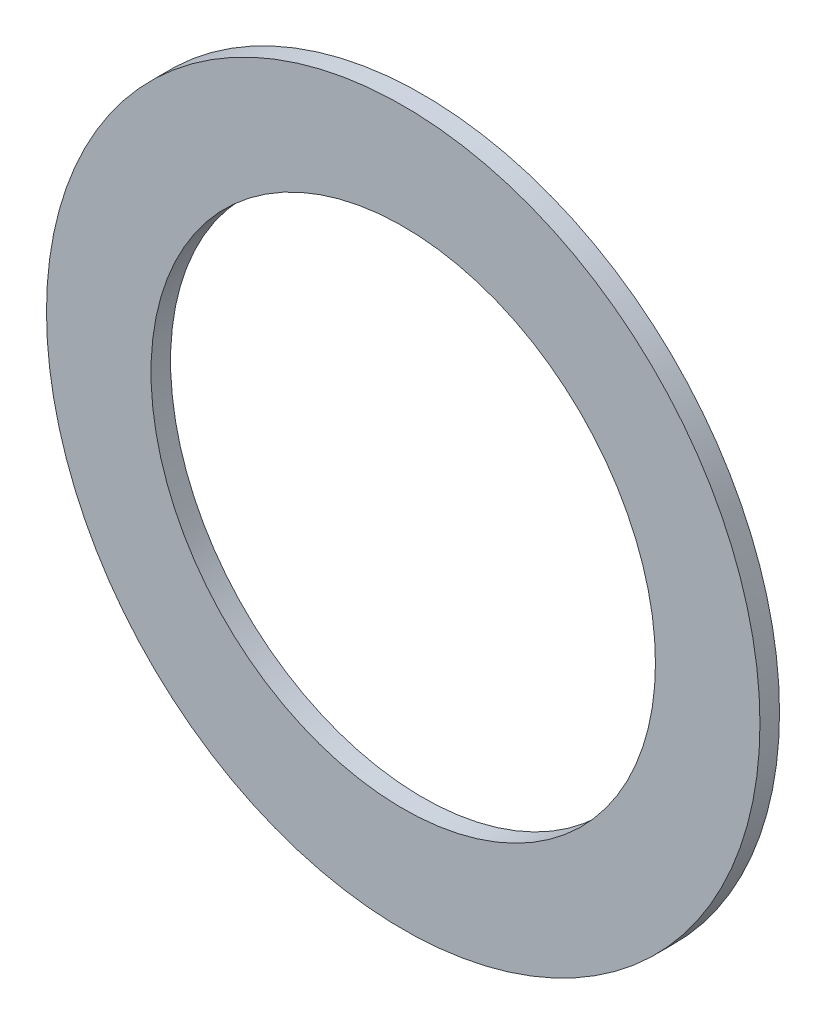
ISO-10303-21;
HEADER;
FILE_DESCRIPTION(('STEP AP214'),'2;1');
FILE_NAME('part.step','',(''),(''),'','','');
FILE_SCHEMA(('AUTOMOTIVE_DESIGN { 1 0 10303 214 1 1 1 1 }'));
ENDSEC;
DATA;
#1=APPLICATION_CONTEXT('core data for automotive mechanical design processes');
#2=APPLICATION_PROTOCOL_DEFINITION('international standard','automotive_design',2000,#1);
#3=PRODUCT_CONTEXT('',#1,'mechanical');
#4=PRODUCT('Part','Part','',(#3));
#5=PRODUCT_RELATED_PRODUCT_CATEGORY('part','',(#4));
#6=PRODUCT_DEFINITION_FORMATION('','',#4);
#7=PRODUCT_DEFINITION_CONTEXT('part definition',#1,'design');
#8=PRODUCT_DEFINITION('design','',#6,#7);
#9=PRODUCT_DEFINITION_SHAPE('','',#8);
#10=(LENGTH_UNIT() NAMED_UNIT(*) SI_UNIT(.MILLI.,.METRE.));
#11=(NAMED_UNIT(*) PLANE_ANGLE_UNIT() SI_UNIT($,.RADIAN.));
#12=(NAMED_UNIT(*) SI_UNIT($,.STERADIAN.) SOLID_ANGLE_UNIT());
#13=UNCERTAINTY_MEASURE_WITH_UNIT(LENGTH_MEASURE(1.E-05),#10,'distance_accuracy_value','');
#14=(GEOMETRIC_REPRESENTATION_CONTEXT(3) GLOBAL_UNCERTAINTY_ASSIGNED_CONTEXT((#13)) GLOBAL_UNIT_ASSIGNED_CONTEXT((#10,
#11,#12)) REPRESENTATION_CONTEXT('',''));
#15=CARTESIAN_POINT('',(0.,0.,0.));
#16=DIRECTION('',(0.,0.,1.));
#17=DIRECTION('',(1.,0.,0.));
#18=AXIS2_PLACEMENT_3D('',#15,#16,#17);
#19=CARTESIAN_POINT('',(0.,0.,4.));
#20=DIRECTION('',(0.,0.,-1.));
#21=DIRECTION('',(-1.,0.,0.));
#22=AXIS2_PLACEMENT_3D('',#19,#20,#21);
#23=CYLINDRICAL_SURFACE('',#22,51.6125);
#24=CARTESIAN_POINT('',(0.,0.,4.));
#25=DIRECTION('',(0.,0.,1.));
#26=DIRECTION('',(1.,0.,0.));
#27=AXIS2_PLACEMENT_3D('',#24,#25,#26);
#28=CIRCLE('',#27,51.6125);
#29=CARTESIAN_POINT('',(51.6125,0.,4.));
#30=VERTEX_POINT('',#29);
#31=EDGE_CURVE('E40',#30,#30,#28,.T.);
#32=ORIENTED_EDGE('',*,*,#31,.T.);
#33=EDGE_LOOP('',(#32));
#34=FACE_BOUND('',#33,.T.);
#35=CARTESIAN_POINT('',(0.,0.,0.));
#36=DIRECTION('',(0.,0.,1.));
#37=DIRECTION('',(1.,0.,0.));
#38=AXIS2_PLACEMENT_3D('',#35,#36,#37);
#39=CIRCLE('',#38,51.6125);
#40=CARTESIAN_POINT('',(51.6125,0.,0.));
#41=VERTEX_POINT('',#40);
#42=EDGE_CURVE('E46',#41,#41,#39,.T.);
#43=ORIENTED_EDGE('',*,*,#42,.F.);
#44=EDGE_LOOP('',(#43));
#45=FACE_BOUND('',#44,.T.);
#46=ADVANCED_FACE('F33',(#34,#45),#23,.F.);
#47=CARTESIAN_POINT('',(0.,0.,4.));
#48=DIRECTION('',(0.,0.,-1.));
#49=DIRECTION('',(-1.,0.,0.));
#50=AXIS2_PLACEMENT_3D('',#47,#48,#49);
#51=CYLINDRICAL_SURFACE('',#50,73.);
#52=CARTESIAN_POINT('',(0.,0.,4.));
#53=DIRECTION('',(0.,0.,1.));
#54=DIRECTION('',(1.,0.,0.));
#55=AXIS2_PLACEMENT_3D('',#52,#53,#54);
#56=CIRCLE('',#55,73.);
#57=CARTESIAN_POINT('',(73.,0.,4.));
#58=VERTEX_POINT('',#57);
#59=EDGE_CURVE('E10',#58,#58,#56,.T.);
#60=ORIENTED_EDGE('',*,*,#59,.F.);
#61=EDGE_LOOP('',(#60));
#62=FACE_BOUND('',#61,.T.);
#63=CARTESIAN_POINT('',(0.,0.,0.));
#64=DIRECTION('',(0.,0.,1.));
#65=DIRECTION('',(1.,0.,0.));
#66=AXIS2_PLACEMENT_3D('',#63,#64,#65);
#67=CIRCLE('',#66,73.);
#68=CARTESIAN_POINT('',(73.,0.,0.));
#69=VERTEX_POINT('',#68);
#70=EDGE_CURVE('E36',#69,#69,#67,.T.);
#71=ORIENTED_EDGE('',*,*,#70,.T.);
#72=EDGE_LOOP('',(#71));
#73=FACE_BOUND('',#72,.T.);
#74=ADVANCED_FACE('F53',(#62,#73),#51,.T.);
#75=CARTESIAN_POINT('',(0.,0.,4.));
#76=DIRECTION('',(0.,0.,1.));
#77=DIRECTION('',(1.,0.,0.));
#78=AXIS2_PLACEMENT_3D('',#75,#76,#77);
#79=PLANE('',#78);
#80=ORIENTED_EDGE('',*,*,#31,.F.);
#81=EDGE_LOOP('',(#80));
#82=FACE_BOUND('',#81,.T.);
#83=ORIENTED_EDGE('',*,*,#59,.T.);
#84=EDGE_LOOP('',(#83));
#85=FACE_BOUND('',#84,.T.);
#86=ADVANCED_FACE('F57',(#82,#85),#79,.T.);
#87=CARTESIAN_POINT('',(0.,0.,0.));
#88=DIRECTION('',(0.,0.,1.));
#89=DIRECTION('',(1.,0.,0.));
#90=AXIS2_PLACEMENT_3D('',#87,#88,#89);
#91=PLANE('',#90);
#92=ORIENTED_EDGE('',*,*,#42,.T.);
#93=EDGE_LOOP('',(#92));
#94=FACE_BOUND('',#93,.T.);
#95=ORIENTED_EDGE('',*,*,#70,.F.);
#96=EDGE_LOOP('',(#95));
#97=FACE_BOUND('',#96,.T.);
#98=ADVANCED_FACE('F55',(#94,#97),#91,.F.);
#99=CLOSED_SHELL('',(#46,#74,#86,#98));
#100=MANIFOLD_SOLID_BREP('B2',#99);
#101=ADVANCED_BREP_SHAPE_REPRESENTATION('',(#18,#100),#14);
#102=SHAPE_DEFINITION_REPRESENTATION(#9,#101);
ENDSEC;
END-ISO-10303-21;
